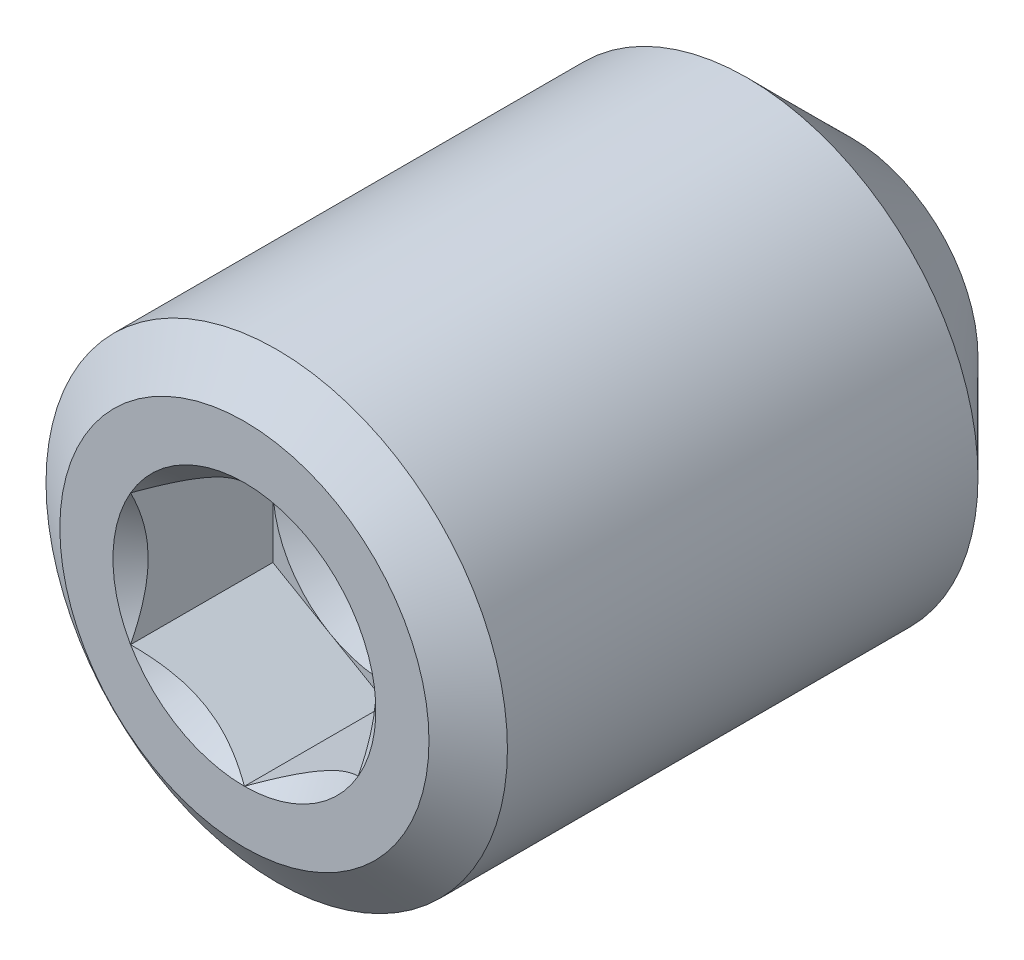
ISO-10303-21;
HEADER;
FILE_DESCRIPTION(('STEP AP214'),'2;1');
FILE_NAME('part.step','',(''),(''),'','','');
FILE_SCHEMA(('AUTOMOTIVE_DESIGN { 1 0 10303 214 1 1 1 1 }'));
ENDSEC;
DATA;
#1=APPLICATION_CONTEXT('core data for automotive mechanical design processes');
#2=APPLICATION_PROTOCOL_DEFINITION('international standard','automotive_design',2000,#1);
#3=PRODUCT_CONTEXT('',#1,'mechanical');
#4=PRODUCT('Part','Part','',(#3));
#5=PRODUCT_RELATED_PRODUCT_CATEGORY('part','',(#4));
#6=PRODUCT_DEFINITION_FORMATION('','',#4);
#7=PRODUCT_DEFINITION_CONTEXT('part definition',#1,'design');
#8=PRODUCT_DEFINITION('design','',#6,#7);
#9=PRODUCT_DEFINITION_SHAPE('','',#8);
#10=(LENGTH_UNIT() NAMED_UNIT(*) SI_UNIT(.MILLI.,.METRE.));
#11=(NAMED_UNIT(*) PLANE_ANGLE_UNIT() SI_UNIT($,.RADIAN.));
#12=(NAMED_UNIT(*) SI_UNIT($,.STERADIAN.) SOLID_ANGLE_UNIT());
#13=UNCERTAINTY_MEASURE_WITH_UNIT(LENGTH_MEASURE(1.E-05),#10,'distance_accuracy_value','');
#14=(GEOMETRIC_REPRESENTATION_CONTEXT(3) GLOBAL_UNCERTAINTY_ASSIGNED_CONTEXT((#13)) GLOBAL_UNIT_ASSIGNED_CONTEXT((#10,
#11,#12)) REPRESENTATION_CONTEXT('',''));
#15=CARTESIAN_POINT('',(0.,0.,0.));
#16=DIRECTION('',(0.,0.,1.));
#17=DIRECTION('',(1.,0.,0.));
#18=AXIS2_PLACEMENT_3D('',#15,#16,#17);
#19=CARTESIAN_POINT('',(-1.190625,2.06222299276171,1.28947798217451));
#20=DIRECTION('',(0.,0.,1.));
#21=DIRECTION('',(1.,0.,0.));
#22=AXIS2_PLACEMENT_3D('',#19,#20,#21);
#23=PLANE('',#22);
#24=CARTESIAN_POINT('',(0.,0.,1.28947798217451));
#25=DIRECTION('',(0.,0.,1.));
#26=DIRECTION('',(1.,0.,0.));
#27=AXIS2_PLACEMENT_3D('',#24,#25,#26);
#28=CIRCLE('',#27,1.19062499999999);
#29=CARTESIAN_POINT('',(1.190625,0.,1.28947798217451));
#30=VERTEX_POINT('',#29);
#31=CARTESIAN_POINT('',(0.5953125,1.03111149638086,1.28947798217451));
#32=VERTEX_POINT('',#31);
#33=EDGE_CURVE('E125',#30,#32,#28,.T.);
#34=ORIENTED_EDGE('',*,*,#33,.F.);
#35=DIRECTION('',(0.,1.,0.));
#36=VECTOR('',#35,1.);
#37=CARTESIAN_POINT('',(1.190625,-0.687407664253887,1.28947798217451));
#38=LINE('',#37,#36);
#39=CARTESIAN_POINT('',(1.190625,0.687407664253911,1.28947798217451));
#40=VERTEX_POINT('',#39);
#41=EDGE_CURVE('E151',#30,#40,#38,.T.);
#42=ORIENTED_EDGE('',*,*,#41,.T.);
#43=DIRECTION('',(-0.866025403784439,0.5,0.));
#44=VECTOR('',#43,1.);
#45=CARTESIAN_POINT('',(1.190625,0.687407664253911,1.28947798217451));
#46=LINE('',#45,#44);
#47=EDGE_CURVE('E146',#40,#32,#46,.T.);
#48=ORIENTED_EDGE('',*,*,#47,.T.);
#49=EDGE_LOOP('',(#34,#42,#48));
#50=FACE_BOUND('',#49,.T.);
#51=ADVANCED_FACE('F41',(#50),#23,.T.);
#52=CARTESIAN_POINT('',(-0.5953125,1.03111149638086,1.28947798217451));
#53=VERTEX_POINT('',#52);
#54=EDGE_CURVE('E127',#32,#53,#28,.T.);
#55=ORIENTED_EDGE('',*,*,#54,.F.);
#56=CARTESIAN_POINT('',(0.,1.37481532850781,1.28947798217451));
#57=VERTEX_POINT('',#56);
#58=EDGE_CURVE('E138',#32,#57,#46,.T.);
#59=ORIENTED_EDGE('',*,*,#58,.T.);
#60=DIRECTION('',(-0.866025403784439,-0.5,0.));
#61=VECTOR('',#60,1.);
#62=CARTESIAN_POINT('',(0.,1.37481532850781,1.28947798217451));
#63=LINE('',#62,#61);
#64=EDGE_CURVE('E141',#57,#53,#63,.T.);
#65=ORIENTED_EDGE('',*,*,#64,.T.);
#66=EDGE_LOOP('',(#55,#59,#65));
#67=FACE_BOUND('',#66,.T.);
#68=ADVANCED_FACE('F137',(#67),#23,.T.);
#69=CARTESIAN_POINT('',(-1.190625,0.,1.28947798217451));
#70=VERTEX_POINT('',#69);
#71=EDGE_CURVE('E142',#53,#70,#28,.T.);
#72=ORIENTED_EDGE('',*,*,#71,.F.);
#73=CARTESIAN_POINT('',(-1.190625,0.68740766425391,1.28947798217451));
#74=VERTEX_POINT('',#73);
#75=EDGE_CURVE('E153',#53,#74,#63,.T.);
#76=ORIENTED_EDGE('',*,*,#75,.T.);
#77=DIRECTION('',(0.,-1.,0.));
#78=VECTOR('',#77,1.);
#79=CARTESIAN_POINT('',(-1.190625,0.68740766425391,1.28947798217451));
#80=LINE('',#79,#78);
#81=EDGE_CURVE('E164',#74,#70,#80,.T.);
#82=ORIENTED_EDGE('',*,*,#81,.T.);
#83=EDGE_LOOP('',(#72,#76,#82));
#84=FACE_BOUND('',#83,.T.);
#85=ADVANCED_FACE('F223',(#84),#23,.T.);
#86=CARTESIAN_POINT('',(-0.595312500000001,-1.03111149638084,1.28947798217451));
#87=VERTEX_POINT('',#86);
#88=EDGE_CURVE('E248',#70,#87,#28,.T.);
#89=ORIENTED_EDGE('',*,*,#88,.F.);
#90=CARTESIAN_POINT('',(-1.190625,-0.687407664253886,1.28947798217451));
#91=VERTEX_POINT('',#90);
#92=EDGE_CURVE('E163',#70,#91,#80,.T.);
#93=ORIENTED_EDGE('',*,*,#92,.T.);
#94=DIRECTION('',(0.866025403784438,-0.5,0.));
#95=VECTOR('',#94,1.);
#96=CARTESIAN_POINT('',(-1.190625,-0.687407664253886,1.28947798217451));
#97=LINE('',#96,#95);
#98=EDGE_CURVE('E168',#91,#87,#97,.T.);
#99=ORIENTED_EDGE('',*,*,#98,.T.);
#100=EDGE_LOOP('',(#89,#93,#99));
#101=FACE_BOUND('',#100,.T.);
#102=ADVANCED_FACE('F239',(#101),#23,.T.);
#103=CARTESIAN_POINT('',(0.5953125,-1.03111149638084,1.28947798217451));
#104=VERTEX_POINT('',#103);
#105=EDGE_CURVE('E62',#87,#104,#28,.T.);
#106=ORIENTED_EDGE('',*,*,#105,.F.);
#107=CARTESIAN_POINT('',(0.,-1.37481532850778,1.28947798217451));
#108=VERTEX_POINT('',#107);
#109=EDGE_CURVE('E167',#87,#108,#97,.T.);
#110=ORIENTED_EDGE('',*,*,#109,.T.);
#111=DIRECTION('',(0.866025403784439,0.5,0.));
#112=VECTOR('',#111,1.);
#113=CARTESIAN_POINT('',(0.,-1.37481532850778,1.28947798217451));
#114=LINE('',#113,#112);
#115=EDGE_CURVE('E172',#108,#104,#114,.T.);
#116=ORIENTED_EDGE('',*,*,#115,.T.);
#117=EDGE_LOOP('',(#106,#110,#116));
#118=FACE_BOUND('',#117,.T.);
#119=ADVANCED_FACE('F215',(#118),#23,.T.);
#120=CARTESIAN_POINT('',(0.,0.,2.77775923217451));
#121=DIRECTION('',(0.,0.,-1.));
#122=DIRECTION('',(0.,1.,0.));
#123=AXIS2_PLACEMENT_3D('',#120,#121,#122);
#124=PLANE('',#123);
#125=CARTESIAN_POINT('',(0.,0.,2.77775923217451));
#126=DIRECTION('',(0.,0.,1.));
#127=DIRECTION('',(1.,0.,0.));
#128=AXIS2_PLACEMENT_3D('',#125,#126,#127);
#129=CIRCLE('',#128,1.37481532850778);
#130=CARTESIAN_POINT('',(0.,1.37481532850781,2.7777592321745));
#131=VERTEX_POINT('',#130);
#132=CARTESIAN_POINT('',(-1.19062499999997,0.68740766425393,2.77775923217451));
#133=VERTEX_POINT('',#132);
#134=EDGE_CURVE('E273',#131,#133,#129,.T.);
#135=ORIENTED_EDGE('',*,*,#134,.F.);
#136=CARTESIAN_POINT('',(1.190625,0.687407664253875,2.77775923217451));
#137=VERTEX_POINT('',#136);
#138=EDGE_CURVE('E274',#137,#131,#129,.T.);
#139=ORIENTED_EDGE('',*,*,#138,.F.);
#140=CARTESIAN_POINT('',(1.19062499999997,-0.687407664253906,2.77775923217451));
#141=VERTEX_POINT('',#140);
#142=EDGE_CURVE('E69',#141,#137,#129,.T.);
#143=ORIENTED_EDGE('',*,*,#142,.F.);
#144=CARTESIAN_POINT('',(0.,-1.37481532850777,2.77775923217451));
#145=VERTEX_POINT('',#144);
#146=EDGE_CURVE('E269',#145,#141,#129,.T.);
#147=ORIENTED_EDGE('',*,*,#146,.F.);
#148=CARTESIAN_POINT('',(-1.190625,-0.687407664253848,2.77775923217451));
#149=VERTEX_POINT('',#148);
#150=EDGE_CURVE('E265',#149,#145,#129,.T.);
#151=ORIENTED_EDGE('',*,*,#150,.F.);
#152=EDGE_CURVE('E268',#133,#149,#129,.T.);
#153=ORIENTED_EDGE('',*,*,#152,.F.);
#154=EDGE_LOOP('',(#135,#139,#143,#147,#151,#153));
#155=FACE_BOUND('',#154,.T.);
#156=CARTESIAN_POINT('',(0.,0.,2.77775923217451));
#157=DIRECTION('',(0.,0.,1.));
#158=DIRECTION('',(0.,-1.,0.));
#159=AXIS2_PLACEMENT_3D('',#156,#157,#158);
#160=CIRCLE('',#159,1.93039999999997);
#161=CARTESIAN_POINT('',(0.,-1.93039999999994,2.77775923217452));
#162=VERTEX_POINT('',#161);
#163=EDGE_CURVE('E180',#162,#162,#160,.T.);
#164=ORIENTED_EDGE('',*,*,#163,.T.);
#165=EDGE_LOOP('',(#164));
#166=FACE_BOUND('',#165,.T.);
#167=ADVANCED_FACE('F43',(#155,#166),#124,.F.);
#168=CARTESIAN_POINT('',(0.,1.32223931889028,-3.5722407678255));
#169=DIRECTION('',(0.,0.,1.));
#170=DIRECTION('',(0.,-1.,0.));
#171=AXIS2_PLACEMENT_3D('',#168,#169,#170);
#172=PLANE('',#171);
#173=CARTESIAN_POINT('',(0.,0.,-3.57224076782549));
#174=DIRECTION('',(0.,0.,1.));
#175=DIRECTION('',(0.,-1.,0.));
#176=AXIS2_PLACEMENT_3D('',#173,#174,#175);
#177=CIRCLE('',#176,1.32223931889029);
#178=CARTESIAN_POINT('',(0.,-1.32223931889029,-3.57224076782549));
#179=VERTEX_POINT('',#178);
#180=EDGE_CURVE('E55',#179,#179,#177,.T.);
#181=ORIENTED_EDGE('',*,*,#180,.F.);
#182=EDGE_LOOP('',(#181));
#183=FACE_BOUND('',#182,.T.);
#184=ADVANCED_FACE('F206',(#183),#172,.F.);
#185=CARTESIAN_POINT('',(0.,0.,-3.57224076782549));
#186=DIRECTION('',(0.,0.,1.));
#187=DIRECTION('',(0.,-1.,0.));
#188=AXIS2_PLACEMENT_3D('',#185,#186,#187);
#189=CONICAL_SURFACE('',#188,1.32223931889029,0.785398163397457);
#190=CARTESIAN_POINT('',(0.,0.,-2.4814800867158));
#191=DIRECTION('',(0.,0.,1.));
#192=DIRECTION('',(0.,-1.,0.));
#193=AXIS2_PLACEMENT_3D('',#190,#191,#192);
#194=CIRCLE('',#193,2.413);
#195=CARTESIAN_POINT('',(0.,-2.41299999999999,-2.48148008671579));
#196=VERTEX_POINT('',#195);
#197=EDGE_CURVE('E199',#196,#196,#194,.T.);
#198=ORIENTED_EDGE('',*,*,#197,.F.);
#199=EDGE_LOOP('',(#198));
#200=FACE_BOUND('',#199,.T.);
#201=ORIENTED_EDGE('',*,*,#180,.T.);
#202=EDGE_LOOP('',(#201));
#203=FACE_BOUND('',#202,.T.);
#204=ADVANCED_FACE('F204',(#200,#203),#189,.T.);
#205=CARTESIAN_POINT('',(0.,0.,-2.7777592321745));
#206=DIRECTION('',(0.,0.,1.));
#207=DIRECTION('',(0.,-1.,0.));
#208=AXIS2_PLACEMENT_3D('',#205,#206,#207);
#209=CYLINDRICAL_SURFACE('',#208,2.41299999999998);
#210=CARTESIAN_POINT('',(0.,0.,2.43983907423451));
#211=DIRECTION('',(0.,0.,1.));
#212=DIRECTION('',(0.,-1.,0.));
#213=AXIS2_PLACEMENT_3D('',#210,#211,#212);
#214=CIRCLE('',#213,2.41299999999997);
#215=CARTESIAN_POINT('',(0.,-2.41299999999994,2.43983907423452));
#216=VERTEX_POINT('',#215);
#217=EDGE_CURVE('E196',#216,#216,#214,.T.);
#218=ORIENTED_EDGE('',*,*,#217,.F.);
#219=EDGE_LOOP('',(#218));
#220=FACE_BOUND('',#219,.T.);
#221=ORIENTED_EDGE('',*,*,#197,.T.);
#222=EDGE_LOOP('',(#221));
#223=FACE_BOUND('',#222,.T.);
#224=ADVANCED_FACE('F212',(#220,#223),#209,.T.);
#225=CARTESIAN_POINT('',(0.,0.,2.43983907423451));
#226=DIRECTION('',(0.,0.,-1.));
#227=DIRECTION('',(0.,1.,0.));
#228=AXIS2_PLACEMENT_3D('',#225,#226,#227);
#229=CONICAL_SURFACE('',#228,2.41299999999997,0.959931088596885);
#230=ORIENTED_EDGE('',*,*,#163,.F.);
#231=EDGE_LOOP('',(#230));
#232=FACE_BOUND('',#231,.T.);
#233=ORIENTED_EDGE('',*,*,#217,.T.);
#234=EDGE_LOOP('',(#233));
#235=FACE_BOUND('',#234,.T.);
#236=ADVANCED_FACE('F299',(#232,#235),#229,.T.);
#237=CARTESIAN_POINT('',(0.,0.,2.77775923217451));
#238=DIRECTION('',(0.,0.,1.));
#239=DIRECTION('',(1.,0.,0.));
#240=AXIS2_PLACEMENT_3D('',#237,#238,#239);
#241=CONICAL_SURFACE('',#240,1.37481532850778,0.78539816339745);
#242=ORIENTED_EDGE('',*,*,#134,.T.);
#243=CARTESIAN_POINT('',(0.000200000000000303,1.37493079856165,2.77787471677455));
#244=CARTESIAN_POINT('',(-0.040734419589856,1.35129730039232,2.75425799638879));
#245=CARTESIAN_POINT('',(-0.0823533883019734,1.32726857760299,2.73202801389765));
#246=CARTESIAN_POINT('',(-0.167219443673632,1.2782711376891,2.69132489480196));
#247=CARTESIAN_POINT('',(-0.21047460729096,1.25329775733079,2.67287441482208));
#248=CARTESIAN_POINT('',(-0.297696647457424,1.20294008896142,2.64126807017885));
#249=CARTESIAN_POINT('',(-0.341641294957925,1.17756863489756,2.62803273641784));
#250=CARTESIAN_POINT('',(-0.430498374163694,1.1262669762987,2.60764068374992));
#251=CARTESIAN_POINT('',(-0.475408088834755,1.10033834044414,2.60046873507052));
#252=CARTESIAN_POINT('',(-0.552804127656979,1.05565371659592,2.59399777082338));
#253=CARTESIAN_POINT('',(-0.585190412515647,1.03695548631471,2.59303955232132));
#254=CARTESIAN_POINT('',(-0.64990607331777,0.999591882129821,2.59465188124661));
#255=CARTESIAN_POINT('',(-0.682235435127273,0.980926516386376,2.59722320735411));
#256=CARTESIAN_POINT('',(-0.746582156071485,0.943775919727766,2.60574598616815));
#257=CARTESIAN_POINT('',(-0.778599196336768,0.925290872911949,2.61170058692709));
#258=CARTESIAN_POINT('',(-0.842098763396458,0.888629380776613,2.62666919624573));
#259=CARTESIAN_POINT('',(-0.873581054644165,0.870453071450043,2.63568451808658));
#260=CARTESIAN_POINT('',(-0.954214838572127,0.823899134593456,2.66244152801254));
#261=CARTESIAN_POINT('',(-1.00285783526766,0.795815087357101,2.68219604661053));
#262=CARTESIAN_POINT('',(-1.09823941635212,0.740746505842255,2.72669600113221));
#263=CARTESIAN_POINT('',(-1.14498361758716,0.713758728676153,2.75142519689068));
#264=CARTESIAN_POINT('',(-1.190825,0.687292194200072,2.77787471677455));
#265=B_SPLINE_CURVE_WITH_KNOTS('',3,(#243,#244,#245,#246,#247,#248,#249,#250,#251,#252,#253,
#254,#255,#256,#257,#258,#259,#260,#261,#262,#263,#264),.UNSPECIFIED.,.F.,.F.,(4,2,2,2,2,2,2,2,
2,2,4),(0.,0.15862567293412,0.318176079843271,0.475191357500656,0.631811068630749,
0.743878551794718,0.855970763007029,0.968167444423242,1.08041232768377,1.25873351645467,
1.43648174479847),.UNSPECIFIED.);
#266=EDGE_CURVE('E11',#131,#133,#265,.T.);
#267=ORIENTED_EDGE('',*,*,#266,.F.);
#268=EDGE_LOOP('',(#242,#267));
#269=FACE_BOUND('',#268,.T.);
#270=ADVANCED_FACE('F237',(#269),#241,.F.);
#271=ORIENTED_EDGE('',*,*,#152,.T.);
#272=CARTESIAN_POINT('',(-1.190625,-1.37097145294691,3.21874967946446));
#273=CARTESIAN_POINT('',(-1.190625,-1.33758920637887,3.19354922098234));
#274=CARTESIAN_POINT('',(-1.190625,-1.30402095496656,3.16859585241197));
#275=CARTESIAN_POINT('',(-1.190625,-1.23643692297759,3.11928531935172));
#276=CARTESIAN_POINT('',(-1.190625,-1.20242103219109,3.09492830607389));
#277=CARTESIAN_POINT('',(-1.190625,-1.09909081482552,3.02255744116373));
#278=CARTESIAN_POINT('',(-1.190625,-1.02900143506764,2.97563185477008));
#279=CARTESIAN_POINT('',(-1.190625,-0.882026737424206,2.88351133550015));
#280=CARTESIAN_POINT('',(-1.190625,-0.804981866019958,2.83856806941658));
#281=CARTESIAN_POINT('',(-1.190625,-0.647043893307944,2.75635725668139));
#282=CARTESIAN_POINT('',(-1.190625,-0.566164943702901,2.71906383390665));
#283=CARTESIAN_POINT('',(-1.190625,-0.444764933868837,2.67343878773762));
#284=CARTESIAN_POINT('',(-1.190625,-0.406041211486695,2.66034407119601));
#285=CARTESIAN_POINT('',(-1.190625,-0.327658904711915,2.63726350807117));
#286=CARTESIAN_POINT('',(-1.190625,-0.288000256118234,2.62727787566048));
#287=CARTESIAN_POINT('',(-1.190625,-0.208647693212079,2.61110046123978));
#288=CARTESIAN_POINT('',(-1.190625,-0.168967240621944,2.6048436780235));
#289=CARTESIAN_POINT('',(-1.190625,-0.0891819742965168,2.59624612059304));
#290=CARTESIAN_POINT('',(-1.190625,-0.0490772347012962,2.59390467322442));
#291=CARTESIAN_POINT('',(-1.190625,0.029707577393192,2.59331147624218));
#292=CARTESIAN_POINT('',(-1.190625,0.0683866068288239,2.59491458597058));
#293=CARTESIAN_POINT('',(-1.190625,0.145416876633165,2.60180225991904));
#294=CARTESIAN_POINT('',(-1.190625,0.183768052740693,2.60708752984301));
#295=CARTESIAN_POINT('',(-1.190625,0.260508634904958,2.62114064440739));
#296=CARTESIAN_POINT('',(-1.190625,0.298887052039146,2.62996759478034));
#297=CARTESIAN_POINT('',(-1.190625,0.374805334250677,2.65063494215515));
#298=CARTESIAN_POINT('',(-1.190625,0.412345269207107,2.66247508701047));
#299=CARTESIAN_POINT('',(-1.190625,0.530535580908852,2.70420656584172));
#300=CARTESIAN_POINT('',(-1.190625,0.60950372574446,2.73885062908887));
#301=CARTESIAN_POINT('',(-1.190625,0.76373026911348,2.81587748414939));
#302=CARTESIAN_POINT('',(-1.190625,0.838974064674619,2.85828807884319));
#303=CARTESIAN_POINT('',(-1.190625,0.982775796189632,2.94578487719949));
#304=CARTESIAN_POINT('',(-1.190625,1.05148016607046,2.99063339422975));
#305=CARTESIAN_POINT('',(-1.190625,1.15270222256255,3.05996456209713));
#306=CARTESIAN_POINT('',(-1.190625,1.18600604145835,3.0833194085117));
#307=CARTESIAN_POINT('',(-1.190625,1.25215860362233,3.13064680119384));
#308=CARTESIAN_POINT('',(-1.190625,1.2850074686828,3.15461917703281));
#309=CARTESIAN_POINT('',(-1.190625,1.31766689427975,3.17884759894578));
#310=B_SPLINE_CURVE_WITH_KNOTS('',3,(#272,#273,#274,#275,#276,#277,#278,#279,#280,#281,#282,
#283,#284,#285,#286,#287,#288,#289,#290,#291,#292,#293,#294,#295,#296,#297,#298,#299,#300,#301,
#302,#303,#304,#305,#306,#307,#308,#309),.UNSPECIFIED.,.F.,.F.,(4,2,2,2,2,2,2,2,2,2,2,2,2,2,2,2,
2,2,4),(0.,0.125475644763328,0.250982782413964,0.503912518769169,0.771279184643216,
1.03772598255656,1.16025581644628,1.28279408906664,1.40312855503245,1.52344233005028,
1.63939577664875,1.75537145240476,1.87336894094836,1.99135655861151,2.24929724983447,
2.50818004711561,2.75419821472194,2.87622362118595,2.99821570388959),.UNSPECIFIED.);
#311=EDGE_CURVE('E259',#133,#149,#310,.F.);
#312=ORIENTED_EDGE('',*,*,#311,.F.);
#313=EDGE_LOOP('',(#271,#312));
#314=FACE_BOUND('',#313,.T.);
#315=ADVANCED_FACE('F324',(#314),#241,.F.);
#316=ORIENTED_EDGE('',*,*,#150,.T.);
#317=CARTESIAN_POINT('',(-1.190825,-0.687292194200048,2.77787471677455));
#318=CARTESIAN_POINT('',(-1.14989058041014,-0.710925692369373,2.75425799638879));
#319=CARTESIAN_POINT('',(-1.10827161169803,-0.734954415158709,2.73202801389765));
#320=CARTESIAN_POINT('',(-1.02340555632637,-0.783951855072597,2.69132489480196));
#321=CARTESIAN_POINT('',(-0.98015039270904,-0.808925235430903,2.67287441482208));
#322=CARTESIAN_POINT('',(-0.892928352542576,-0.859282903800279,2.64126807017885));
#323=CARTESIAN_POINT('',(-0.848983705042076,-0.884654357864136,2.62803273641784));
#324=CARTESIAN_POINT('',(-0.760126625836307,-0.935956016462991,2.60764068374992));
#325=CARTESIAN_POINT('',(-0.715216911165246,-0.961884652317557,2.60046873507052));
#326=CARTESIAN_POINT('',(-0.637820872343023,-1.00656927616578,2.59399777082338));
#327=CARTESIAN_POINT('',(-0.605434587484355,-1.02526750644698,2.59303955232132));
#328=CARTESIAN_POINT('',(-0.540718926682231,-1.06263111063187,2.59465188124661));
#329=CARTESIAN_POINT('',(-0.508389564872729,-1.08129647637532,2.59722320735411));
#330=CARTESIAN_POINT('',(-0.444042843928517,-1.11844707303393,2.60574598616815));
#331=CARTESIAN_POINT('',(-0.412025803663233,-1.13693211984975,2.61170058692709));
#332=CARTESIAN_POINT('',(-0.348526236603544,-1.17359361198508,2.62666919624573));
#333=CARTESIAN_POINT('',(-0.317043945355837,-1.19176992131165,2.63568451808658));
#334=CARTESIAN_POINT('',(-0.236410161427874,-1.23832385816824,2.66244152801254));
#335=CARTESIAN_POINT('',(-0.187767164732343,-1.26640790540459,2.68219604661054));
#336=CARTESIAN_POINT('',(-0.092385583647882,-1.32147648691944,2.72669600113221));
#337=CARTESIAN_POINT('',(-0.0456413824128455,-1.34846426408554,2.75142519689069));
#338=CARTESIAN_POINT('',(0.000199999999999356,-1.37493079856162,2.77787471677455));
#339=B_SPLINE_CURVE_WITH_KNOTS('',3,(#317,#318,#319,#320,#321,#322,#323,#324,#325,#326,#327,
#328,#329,#330,#331,#332,#333,#334,#335,#336,#337,#338),.UNSPECIFIED.,.F.,.F.,(4,2,2,2,2,2,2,2,
2,2,4),(0.,0.15862567293412,0.318176079843271,0.475191357500655,0.631811068630748,
0.743878551794717,0.855970763007028,0.968167444423241,1.08041232768376,1.25873351645467,
1.43648174479847),.UNSPECIFIED.);
#340=EDGE_CURVE('E262',#149,#145,#339,.T.);
#341=ORIENTED_EDGE('',*,*,#340,.F.);
#342=EDGE_LOOP('',(#316,#341));
#343=FACE_BOUND('',#342,.T.);
#344=ADVANCED_FACE('F331',(#343),#241,.F.);
#345=ORIENTED_EDGE('',*,*,#146,.T.);
#346=CARTESIAN_POINT('',(-0.000200000000000535,-1.37493079856162,2.77787471677455));
#347=CARTESIAN_POINT('',(0.0407344195898559,-1.3512973003923,2.75425799638879));
#348=CARTESIAN_POINT('',(0.0823533883019735,-1.32726857760296,2.73202801389765));
#349=CARTESIAN_POINT('',(0.167219443673632,-1.27827113768907,2.69132489480196));
#350=CARTESIAN_POINT('',(0.21047460729096,-1.25329775733077,2.67287441482208));
#351=CARTESIAN_POINT('',(0.297696647457424,-1.20294008896139,2.64126807017885));
#352=CARTESIAN_POINT('',(0.341641294957925,-1.17756863489753,2.62803273641784));
#353=CARTESIAN_POINT('',(0.430498374163693,-1.12626697629868,2.60764068374992));
#354=CARTESIAN_POINT('',(0.475408088834755,-1.10033834044411,2.60046873507052));
#355=CARTESIAN_POINT('',(0.552804127656978,-1.05565371659589,2.59399777082338));
#356=CARTESIAN_POINT('',(0.585190412515646,-1.03695548631469,2.59303955232132));
#357=CARTESIAN_POINT('',(0.64990607331777,-0.999591882129798,2.59465188124661));
#358=CARTESIAN_POINT('',(0.682235435127272,-0.980926516386353,2.59722320735411));
#359=CARTESIAN_POINT('',(0.746582156071484,-0.943775919727742,2.60574598616815));
#360=CARTESIAN_POINT('',(0.778599196336768,-0.925290872911926,2.61170058692709));
#361=CARTESIAN_POINT('',(0.842098763396457,-0.888629380776589,2.62666919624573));
#362=CARTESIAN_POINT('',(0.873581054644164,-0.870453071450019,2.63568451808658));
#363=CARTESIAN_POINT('',(0.954214838572126,-0.823899134593432,2.66244152801254));
#364=CARTESIAN_POINT('',(1.00285783526766,-0.795815087357077,2.68219604661053));
#365=CARTESIAN_POINT('',(1.09823941635212,-0.740746505842232,2.72669600113221));
#366=CARTESIAN_POINT('',(1.14498361758715,-0.71375872867613,2.75142519689068));
#367=CARTESIAN_POINT('',(1.190825,-0.687292194200049,2.77787471677455));
#368=B_SPLINE_CURVE_WITH_KNOTS('',3,(#346,#347,#348,#349,#350,#351,#352,#353,#354,#355,#356,
#357,#358,#359,#360,#361,#362,#363,#364,#365,#366,#367),.UNSPECIFIED.,.F.,.F.,(4,2,2,2,2,2,2,2,
2,2,4),(0.,0.15862567293412,0.318176079843271,0.475191357500656,0.631811068630749,
0.743878551794718,0.855970763007029,0.968167444423242,1.08041232768377,1.25873351645467,
1.43648174479847),.UNSPECIFIED.);
#369=EDGE_CURVE('E462',#145,#141,#368,.T.);
#370=ORIENTED_EDGE('',*,*,#369,.F.);
#371=EDGE_LOOP('',(#345,#370));
#372=FACE_BOUND('',#371,.T.);
#373=ADVANCED_FACE('F338',(#372),#241,.F.);
#374=ORIENTED_EDGE('',*,*,#142,.T.);
#375=CARTESIAN_POINT('',(1.190625,-1.37097145294691,3.21874967946446));
#376=CARTESIAN_POINT('',(1.190625,-1.33758920637888,3.19354922098234));
#377=CARTESIAN_POINT('',(1.190625,-1.30402095496656,3.16859585241197));
#378=CARTESIAN_POINT('',(1.190625,-1.23643692297759,3.11928531935172));
#379=CARTESIAN_POINT('',(1.190625,-1.2024210321911,3.09492830607389));
#380=CARTESIAN_POINT('',(1.190625,-1.09909081482552,3.02255744116373));
#381=CARTESIAN_POINT('',(1.190625,-1.02900143506765,2.97563185477008));
#382=CARTESIAN_POINT('',(1.190625,-0.882026737424208,2.88351133550015));
#383=CARTESIAN_POINT('',(1.190625,-0.80498186601996,2.83856806941658));
#384=CARTESIAN_POINT('',(1.190625,-0.647043893307945,2.75635725668139));
#385=CARTESIAN_POINT('',(1.190625,-0.566164943702902,2.71906383390664));
#386=CARTESIAN_POINT('',(1.190625,-0.444764933868838,2.67343878773762));
#387=CARTESIAN_POINT('',(1.190625,-0.406041211486696,2.66034407119601));
#388=CARTESIAN_POINT('',(1.190625,-0.327658904711916,2.63726350807117));
#389=CARTESIAN_POINT('',(1.190625,-0.288000256118235,2.62727787566048));
#390=CARTESIAN_POINT('',(1.190625,-0.20864769321208,2.61110046123978));
#391=CARTESIAN_POINT('',(1.190625,-0.168967240621945,2.6048436780235));
#392=CARTESIAN_POINT('',(1.190625,-0.0891819742965176,2.59624612059304));
#393=CARTESIAN_POINT('',(1.190625,-0.0490772347012969,2.59390467322442));
#394=CARTESIAN_POINT('',(1.190625,0.0297075773931914,2.59331147624218));
#395=CARTESIAN_POINT('',(1.190625,0.0683866068288234,2.59491458597057));
#396=CARTESIAN_POINT('',(1.190625,0.145416876633165,2.60180225991904));
#397=CARTESIAN_POINT('',(1.190625,0.183768052740693,2.60708752984301));
#398=CARTESIAN_POINT('',(1.190625,0.260508634904957,2.62114064440739));
#399=CARTESIAN_POINT('',(1.190625,0.298887052039145,2.62996759478034));
#400=CARTESIAN_POINT('',(1.190625,0.374805334250676,2.65063494215515));
#401=CARTESIAN_POINT('',(1.190625,0.412345269207107,2.66247508701046));
#402=CARTESIAN_POINT('',(1.190625,0.530535580908852,2.70420656584172));
#403=CARTESIAN_POINT('',(1.190625,0.609503725744459,2.73885062908887));
#404=CARTESIAN_POINT('',(1.190625,0.763730269113479,2.81587748414939));
#405=CARTESIAN_POINT('',(1.190625,0.838974064674618,2.85828807884319));
#406=CARTESIAN_POINT('',(1.190625,0.982775796189631,2.94578487719949));
#407=CARTESIAN_POINT('',(1.190625,1.05148016607045,2.99063339422975));
#408=CARTESIAN_POINT('',(1.190625,1.15270222256255,3.05996456209713));
#409=CARTESIAN_POINT('',(1.190625,1.18600604145835,3.0833194085117));
#410=CARTESIAN_POINT('',(1.190625,1.25215860362233,3.13064680119384));
#411=CARTESIAN_POINT('',(1.190625,1.2850074686828,3.15461917703281));
#412=CARTESIAN_POINT('',(1.190625,1.31766689427975,3.17884759894578));
#413=B_SPLINE_CURVE_WITH_KNOTS('',3,(#375,#376,#377,#378,#379,#380,#381,#382,#383,#384,#385,
#386,#387,#388,#389,#390,#391,#392,#393,#394,#395,#396,#397,#398,#399,#400,#401,#402,#403,#404,
#405,#406,#407,#408,#409,#410,#411,#412),.UNSPECIFIED.,.F.,.F.,(4,2,2,2,2,2,2,2,2,2,2,2,2,2,2,2,
2,2,4),(0.,0.125475644763328,0.250982782413965,0.50391251876917,0.771279184643218,
1.03772598255656,1.16025581644628,1.28279408906664,1.40312855503245,1.52344233005029,
1.63939577664875,1.75537145240476,1.87336894094837,1.99135655861151,2.24929724983447,
2.50818004711562,2.75419821472195,2.87622362118595,2.99821570388959),.UNSPECIFIED.);
#414=EDGE_CURVE('E456',#141,#137,#413,.T.);
#415=ORIENTED_EDGE('',*,*,#414,.F.);
#416=EDGE_LOOP('',(#374,#415));
#417=FACE_BOUND('',#416,.T.);
#418=ADVANCED_FACE('F235',(#417),#241,.F.);
#419=ORIENTED_EDGE('',*,*,#138,.T.);
#420=CARTESIAN_POINT('',(1.190825,0.687292194200073,2.77787471677455));
#421=CARTESIAN_POINT('',(1.14989058041014,0.710925692369398,2.75425799638879));
#422=CARTESIAN_POINT('',(1.10827161169803,0.734954415158733,2.73202801389765));
#423=CARTESIAN_POINT('',(1.02340555632637,0.783951855072622,2.69132489480196));
#424=CARTESIAN_POINT('',(0.980150392709039,0.808925235430928,2.67287441482208));
#425=CARTESIAN_POINT('',(0.892928352542575,0.859282903800304,2.64126807017885));
#426=CARTESIAN_POINT('',(0.848983705042074,0.884654357864161,2.62803273641784));
#427=CARTESIAN_POINT('',(0.760126625836306,0.935956016463016,2.60764068374992));
#428=CARTESIAN_POINT('',(0.715216911165245,0.961884652317582,2.60046873507052));
#429=CARTESIAN_POINT('',(0.637820872343021,1.0065692761658,2.59399777082338));
#430=CARTESIAN_POINT('',(0.605434587484353,1.02526750644701,2.59303955232132));
#431=CARTESIAN_POINT('',(0.54071892668223,1.0626311106319,2.59465188124661));
#432=CARTESIAN_POINT('',(0.508389564872727,1.08129647637534,2.59722320735411));
#433=CARTESIAN_POINT('',(0.444042843928515,1.11844707303395,2.60574598616815));
#434=CARTESIAN_POINT('',(0.412025803663231,1.13693211984977,2.61170058692709));
#435=CARTESIAN_POINT('',(0.348526236603542,1.17359361198511,2.62666919624573));
#436=CARTESIAN_POINT('',(0.317043945355835,1.19176992131168,2.63568451808658));
#437=CARTESIAN_POINT('',(0.236410161427873,1.23832385816826,2.66244152801254));
#438=CARTESIAN_POINT('',(0.187767164732342,1.26640790540462,2.68219604661053));
#439=CARTESIAN_POINT('',(0.0923855836478813,1.32147648691946,2.72669600113221));
#440=CARTESIAN_POINT('',(0.0456413824128449,1.34846426408557,2.75142519689068));
#441=CARTESIAN_POINT('',(-0.000199999999999624,1.37493079856165,2.77787471677455));
#442=B_SPLINE_CURVE_WITH_KNOTS('',3,(#420,#421,#422,#423,#424,#425,#426,#427,#428,#429,#430,
#431,#432,#433,#434,#435,#436,#437,#438,#439,#440,#441),.UNSPECIFIED.,.F.,.F.,(4,2,2,2,2,2,2,2,
2,2,4),(0.,0.15862567293412,0.318176079843271,0.475191357500655,0.631811068630748,
0.743878551794717,0.855970763007028,0.968167444423241,1.08041232768376,1.25873351645467,
1.43648174479846),.UNSPECIFIED.);
#443=EDGE_CURVE('E149',#137,#131,#442,.T.);
#444=ORIENTED_EDGE('',*,*,#443,.F.);
#445=EDGE_LOOP('',(#419,#444));
#446=FACE_BOUND('',#445,.T.);
#447=ADVANCED_FACE('F227',(#446),#241,.F.);
#448=EDGE_CURVE('E129',#104,#30,#28,.T.);
#449=ORIENTED_EDGE('',*,*,#448,.F.);
#450=CARTESIAN_POINT('',(1.190625,-0.687407664253887,1.28947798217451));
#451=VERTEX_POINT('',#450);
#452=EDGE_CURVE('E171',#104,#451,#114,.T.);
#453=ORIENTED_EDGE('',*,*,#452,.T.);
#454=EDGE_CURVE('E175',#451,#30,#38,.T.);
#455=ORIENTED_EDGE('',*,*,#454,.T.);
#456=EDGE_LOOP('',(#449,#453,#455));
#457=FACE_BOUND('',#456,.T.);
#458=ADVANCED_FACE('F219',(#457),#23,.T.);
#459=CARTESIAN_POINT('',(0.,1.37481532850781,1.28947798217451));
#460=DIRECTION('',(-0.5,0.866025403784439,0.));
#461=DIRECTION('',(-0.866025403784439,-0.5,0.));
#462=AXIS2_PLACEMENT_3D('',#459,#460,#461);
#463=PLANE('',#462);
#464=DIRECTION('',(0.,0.,1.));
#465=VECTOR('',#464,1.);
#466=CARTESIAN_POINT('',(0.,1.37481532850781,1.28947798217451));
#467=LINE('',#466,#465);
#468=EDGE_CURVE('E148',#57,#131,#467,.T.);
#469=ORIENTED_EDGE('',*,*,#468,.T.);
#470=ORIENTED_EDGE('',*,*,#266,.T.);
#471=DIRECTION('',(0.,0.,1.));
#472=VECTOR('',#471,1.);
#473=CARTESIAN_POINT('',(-1.190625,0.68740766425391,1.28947798217451));
#474=LINE('',#473,#472);
#475=EDGE_CURVE('E190',#74,#133,#474,.T.);
#476=ORIENTED_EDGE('',*,*,#475,.F.);
#477=ORIENTED_EDGE('',*,*,#75,.F.);
#478=ORIENTED_EDGE('',*,*,#64,.F.);
#479=EDGE_LOOP('',(#469,#470,#476,#477,#478));
#480=FACE_BOUND('',#479,.T.);
#481=ADVANCED_FACE('F226',(#480),#463,.F.);
#482=CARTESIAN_POINT('',(-1.190625,0.68740766425391,1.28947798217451));
#483=DIRECTION('',(-1.,0.,0.));
#484=DIRECTION('',(0.,0.,1.));
#485=AXIS2_PLACEMENT_3D('',#482,#483,#484);
#486=PLANE('',#485);
#487=ORIENTED_EDGE('',*,*,#475,.T.);
#488=ORIENTED_EDGE('',*,*,#311,.T.);
#489=DIRECTION('',(0.,0.,1.));
#490=VECTOR('',#489,1.);
#491=CARTESIAN_POINT('',(-1.190625,-0.687407664253886,1.28947798217451));
#492=LINE('',#491,#490);
#493=EDGE_CURVE('E187',#91,#149,#492,.T.);
#494=ORIENTED_EDGE('',*,*,#493,.F.);
#495=ORIENTED_EDGE('',*,*,#92,.F.);
#496=ORIENTED_EDGE('',*,*,#81,.F.);
#497=EDGE_LOOP('',(#487,#488,#494,#495,#496));
#498=FACE_BOUND('',#497,.T.);
#499=ADVANCED_FACE('F233',(#498),#486,.F.);
#500=CARTESIAN_POINT('',(-1.190625,-0.687407664253886,1.28947798217451));
#501=DIRECTION('',(-0.500000000000001,-0.866025403784438,0.));
#502=DIRECTION('',(0.866025403784438,-0.500000000000001,0.));
#503=AXIS2_PLACEMENT_3D('',#500,#501,#502);
#504=PLANE('',#503);
#505=ORIENTED_EDGE('',*,*,#493,.T.);
#506=ORIENTED_EDGE('',*,*,#340,.T.);
#507=DIRECTION('',(0.,0.,1.));
#508=VECTOR('',#507,1.);
#509=CARTESIAN_POINT('',(0.,-1.37481532850778,1.28947798217451));
#510=LINE('',#509,#508);
#511=EDGE_CURVE('E184',#108,#145,#510,.T.);
#512=ORIENTED_EDGE('',*,*,#511,.F.);
#513=ORIENTED_EDGE('',*,*,#109,.F.);
#514=ORIENTED_EDGE('',*,*,#98,.F.);
#515=EDGE_LOOP('',(#505,#506,#512,#513,#514));
#516=FACE_BOUND('',#515,.T.);
#517=ADVANCED_FACE('F251',(#516),#504,.F.);
#518=CARTESIAN_POINT('',(0.,-1.37481532850778,1.28947798217451));
#519=DIRECTION('',(0.5,-0.866025403784439,0.));
#520=DIRECTION('',(0.866025403784439,0.5,0.));
#521=AXIS2_PLACEMENT_3D('',#518,#519,#520);
#522=PLANE('',#521);
#523=ORIENTED_EDGE('',*,*,#511,.T.);
#524=ORIENTED_EDGE('',*,*,#369,.T.);
#525=DIRECTION('',(0.,0.,1.));
#526=VECTOR('',#525,1.);
#527=CARTESIAN_POINT('',(1.190625,-0.687407664253887,1.28947798217451));
#528=LINE('',#527,#526);
#529=EDGE_CURVE('E181',#451,#141,#528,.T.);
#530=ORIENTED_EDGE('',*,*,#529,.F.);
#531=ORIENTED_EDGE('',*,*,#452,.F.);
#532=ORIENTED_EDGE('',*,*,#115,.F.);
#533=EDGE_LOOP('',(#523,#524,#530,#531,#532));
#534=FACE_BOUND('',#533,.T.);
#535=ADVANCED_FACE('F407',(#534),#522,.F.);
#536=CARTESIAN_POINT('',(1.190625,-0.687407664253887,1.28947798217451));
#537=DIRECTION('',(1.,0.,0.));
#538=DIRECTION('',(0.,0.,-1.));
#539=AXIS2_PLACEMENT_3D('',#536,#537,#538);
#540=PLANE('',#539);
#541=ORIENTED_EDGE('',*,*,#529,.T.);
#542=ORIENTED_EDGE('',*,*,#414,.T.);
#543=DIRECTION('',(0.,0.,1.));
#544=VECTOR('',#543,1.);
#545=CARTESIAN_POINT('',(1.190625,0.687407664253911,1.28947798217451));
#546=LINE('',#545,#544);
#547=EDGE_CURVE('E178',#40,#137,#546,.T.);
#548=ORIENTED_EDGE('',*,*,#547,.F.);
#549=ORIENTED_EDGE('',*,*,#41,.F.);
#550=ORIENTED_EDGE('',*,*,#454,.F.);
#551=EDGE_LOOP('',(#541,#542,#548,#549,#550));
#552=FACE_BOUND('',#551,.T.);
#553=ADVANCED_FACE('F298',(#552),#540,.F.);
#554=CARTESIAN_POINT('',(1.190625,0.687407664253911,1.28947798217451));
#555=DIRECTION('',(0.5,0.866025403784439,0.));
#556=DIRECTION('',(-0.866025403784439,0.5,0.));
#557=AXIS2_PLACEMENT_3D('',#554,#555,#556);
#558=PLANE('',#557);
#559=ORIENTED_EDGE('',*,*,#547,.T.);
#560=ORIENTED_EDGE('',*,*,#443,.T.);
#561=ORIENTED_EDGE('',*,*,#468,.F.);
#562=ORIENTED_EDGE('',*,*,#58,.F.);
#563=ORIENTED_EDGE('',*,*,#47,.F.);
#564=EDGE_LOOP('',(#559,#560,#561,#562,#563));
#565=FACE_BOUND('',#564,.T.);
#566=ADVANCED_FACE('F122',(#565),#558,.F.);
#567=CARTESIAN_POINT('',(0.,0.,1.28947798217451));
#568=DIRECTION('',(0.,0.,1.));
#569=DIRECTION('',(1.,0.,0.));
#570=AXIS2_PLACEMENT_3D('',#567,#568,#569);
#571=CONICAL_SURFACE('',#570,1.19062499999999,1.0471975511966);
#572=CARTESIAN_POINT('',(0.,0.,0.602070317920617));
#573=VERTEX_POINT('',#572);
#574=VERTEX_LOOP('',#573);
#575=FACE_BOUND('',#574,.T.);
#576=ORIENTED_EDGE('',*,*,#33,.T.);
#577=ORIENTED_EDGE('',*,*,#54,.T.);
#578=ORIENTED_EDGE('',*,*,#71,.T.);
#579=ORIENTED_EDGE('',*,*,#88,.T.);
#580=ORIENTED_EDGE('',*,*,#105,.T.);
#581=ORIENTED_EDGE('',*,*,#448,.T.);
#582=EDGE_LOOP('',(#576,#577,#578,#579,#580,#581));
#583=FACE_BOUND('',#582,.T.);
#584=ADVANCED_FACE('F120',(#575,#583),#571,.F.);
#585=CLOSED_SHELL('',(#51,#68,#85,#102,#119,#167,#184,#204,#224,#236,#270,#315,#344,#373,#418,
#447,#458,#481,#499,#517,#535,#553,#566,#584));
#586=MANIFOLD_SOLID_BREP('B2',#585);
#587=ADVANCED_BREP_SHAPE_REPRESENTATION('',(#18,#586),#14);
#588=SHAPE_DEFINITION_REPRESENTATION(#9,#587);
ENDSEC;
END-ISO-10303-21;
